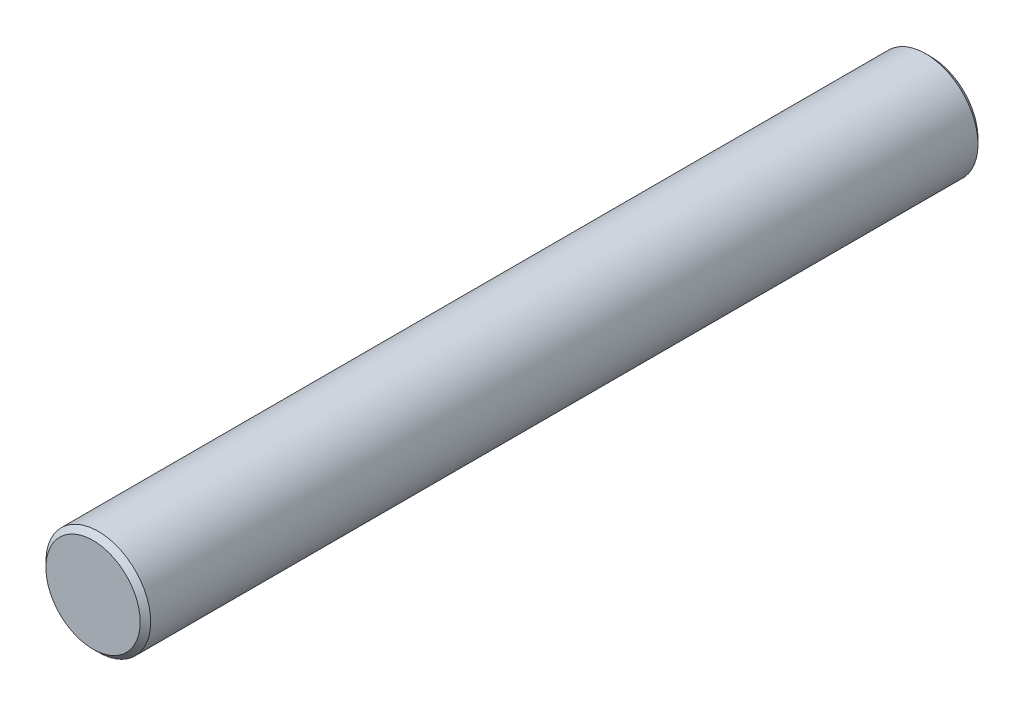
ISO-10303-21;
HEADER;
FILE_DESCRIPTION(('STEP AP214'),'2;1');
FILE_NAME('part.step','',(''),(''),'','','');
FILE_SCHEMA(('AUTOMOTIVE_DESIGN { 1 0 10303 214 1 1 1 1 }'));
ENDSEC;
DATA;
#1=APPLICATION_CONTEXT('core data for automotive mechanical design processes');
#2=APPLICATION_PROTOCOL_DEFINITION('international standard','automotive_design',2000,#1);
#3=PRODUCT_CONTEXT('',#1,'mechanical');
#4=PRODUCT('Part','Part','',(#3));
#5=PRODUCT_RELATED_PRODUCT_CATEGORY('part','',(#4));
#6=PRODUCT_DEFINITION_FORMATION('','',#4);
#7=PRODUCT_DEFINITION_CONTEXT('part definition',#1,'design');
#8=PRODUCT_DEFINITION('design','',#6,#7);
#9=PRODUCT_DEFINITION_SHAPE('','',#8);
#10=(LENGTH_UNIT() NAMED_UNIT(*) SI_UNIT(.MILLI.,.METRE.));
#11=(NAMED_UNIT(*) PLANE_ANGLE_UNIT() SI_UNIT($,.RADIAN.));
#12=(NAMED_UNIT(*) SI_UNIT($,.STERADIAN.) SOLID_ANGLE_UNIT());
#13=UNCERTAINTY_MEASURE_WITH_UNIT(LENGTH_MEASURE(1.E-05),#10,'distance_accuracy_value','');
#14=(GEOMETRIC_REPRESENTATION_CONTEXT(3) GLOBAL_UNCERTAINTY_ASSIGNED_CONTEXT((#13)) GLOBAL_UNIT_ASSIGNED_CONTEXT((#10,
#11,#12)) REPRESENTATION_CONTEXT('',''));
#15=CARTESIAN_POINT('',(0.,0.,0.));
#16=DIRECTION('',(0.,0.,1.));
#17=DIRECTION('',(1.,0.,0.));
#18=AXIS2_PLACEMENT_3D('',#15,#16,#17);
#19=CARTESIAN_POINT('',(0.,0.,80.));
#20=DIRECTION('',(0.,0.,-1.));
#21=DIRECTION('',(-1.,0.,0.));
#22=AXIS2_PLACEMENT_3D('',#19,#20,#21);
#23=CYLINDRICAL_SURFACE('',#22,5.);
#24=CARTESIAN_POINT('',(0.,0.,0.500000000000014));
#25=DIRECTION('',(0.,0.,1.));
#26=DIRECTION('',(1.,0.,0.));
#27=AXIS2_PLACEMENT_3D('',#24,#25,#26);
#28=CIRCLE('',#27,5.);
#29=CARTESIAN_POINT('',(5.,0.,0.500000000000014));
#30=VERTEX_POINT('',#29);
#31=EDGE_CURVE('E58',#30,#30,#28,.T.);
#32=ORIENTED_EDGE('',*,*,#31,.T.);
#33=EDGE_LOOP('',(#32));
#34=FACE_BOUND('',#33,.T.);
#35=CARTESIAN_POINT('',(0.,0.,79.5));
#36=DIRECTION('',(0.,0.,1.));
#37=DIRECTION('',(1.,0.,0.));
#38=AXIS2_PLACEMENT_3D('',#35,#36,#37);
#39=CIRCLE('',#38,5.);
#40=CARTESIAN_POINT('',(5.,0.,79.5));
#41=VERTEX_POINT('',#40);
#42=EDGE_CURVE('E54',#41,#41,#39,.F.);
#43=ORIENTED_EDGE('',*,*,#42,.T.);
#44=EDGE_LOOP('',(#43));
#45=FACE_BOUND('',#44,.T.);
#46=ADVANCED_FACE('F34',(#34,#45),#23,.T.);
#47=CARTESIAN_POINT('',(0.,0.,80.));
#48=DIRECTION('',(0.,0.,1.));
#49=DIRECTION('',(1.,0.,0.));
#50=AXIS2_PLACEMENT_3D('',#47,#48,#49);
#51=PLANE('',#50);
#52=CARTESIAN_POINT('',(0.,0.,80.));
#53=DIRECTION('',(0.,0.,1.));
#54=DIRECTION('',(1.,0.,0.));
#55=AXIS2_PLACEMENT_3D('',#52,#53,#54);
#56=CIRCLE('',#55,4.5);
#57=CARTESIAN_POINT('',(4.5,0.,80.));
#58=VERTEX_POINT('',#57);
#59=EDGE_CURVE('E11',#58,#58,#56,.T.);
#60=ORIENTED_EDGE('',*,*,#59,.T.);
#61=EDGE_LOOP('',(#60));
#62=FACE_BOUND('',#61,.T.);
#63=ADVANCED_FACE('F79',(#62),#51,.T.);
#64=CARTESIAN_POINT('',(0.,0.,0.));
#65=DIRECTION('',(0.,0.,1.));
#66=DIRECTION('',(1.,0.,0.));
#67=AXIS2_PLACEMENT_3D('',#64,#65,#66);
#68=PLANE('',#67);
#69=CARTESIAN_POINT('',(0.,0.,0.));
#70=DIRECTION('',(0.,0.,1.));
#71=DIRECTION('',(1.,0.,0.));
#72=AXIS2_PLACEMENT_3D('',#69,#70,#71);
#73=CIRCLE('',#72,4.49999999999999);
#74=CARTESIAN_POINT('',(4.49999999999999,0.,0.));
#75=VERTEX_POINT('',#74);
#76=EDGE_CURVE('E41',#75,#75,#73,.F.);
#77=ORIENTED_EDGE('',*,*,#76,.T.);
#78=EDGE_LOOP('',(#77));
#79=FACE_BOUND('',#78,.T.);
#80=CARTESIAN_POINT('',(0.,0.,0.));
#81=DIRECTION('',(0.,0.,-1.));
#82=DIRECTION('',(-1.,0.,0.));
#83=AXIS2_PLACEMENT_3D('',#80,#81,#82);
#84=CIRCLE('',#83,2.5);
#85=CARTESIAN_POINT('',(-2.5,0.,0.));
#86=VERTEX_POINT('',#85);
#87=EDGE_CURVE('E109',#86,#86,#84,.T.);
#88=ORIENTED_EDGE('',*,*,#87,.F.);
#89=EDGE_LOOP('',(#88));
#90=FACE_BOUND('',#89,.T.);
#91=ADVANCED_FACE('F48',(#79,#90),#68,.F.);
#92=CARTESIAN_POINT('',(0.,0.,17.4));
#93=DIRECTION('',(0.,0.,-1.));
#94=DIRECTION('',(-1.,0.,0.));
#95=AXIS2_PLACEMENT_3D('',#92,#93,#94);
#96=CONICAL_SURFACE('',#95,2.1,1.02974425867665);
#97=CARTESIAN_POINT('',(0.,0.,18.6618072999579));
#98=VERTEX_POINT('',#97);
#99=VERTEX_LOOP('',#98);
#100=FACE_BOUND('',#99,.T.);
#101=CARTESIAN_POINT('',(0.,0.,17.4));
#102=DIRECTION('',(0.,0.,-1.));
#103=DIRECTION('',(-1.,0.,0.));
#104=AXIS2_PLACEMENT_3D('',#101,#102,#103);
#105=CIRCLE('',#104,2.1);
#106=CARTESIAN_POINT('',(-2.1,0.,17.4));
#107=VERTEX_POINT('',#106);
#108=EDGE_CURVE('E52',#107,#107,#105,.T.);
#109=ORIENTED_EDGE('',*,*,#108,.T.);
#110=EDGE_LOOP('',(#109));
#111=FACE_BOUND('',#110,.T.);
#112=ADVANCED_FACE('F44',(#100,#111),#96,.F.);
#113=CARTESIAN_POINT('',(0.,0.,0.));
#114=DIRECTION('',(0.,0.,-1.));
#115=DIRECTION('',(-1.,0.,0.));
#116=AXIS2_PLACEMENT_3D('',#113,#114,#115);
#117=CYLINDRICAL_SURFACE('',#116,2.1);
#118=ORIENTED_EDGE('',*,*,#108,.F.);
#119=EDGE_LOOP('',(#118));
#120=FACE_BOUND('',#119,.T.);
#121=CARTESIAN_POINT('',(0.,0.,15.));
#122=DIRECTION('',(0.,0.,-1.));
#123=DIRECTION('',(-1.,0.,0.));
#124=AXIS2_PLACEMENT_3D('',#121,#122,#123);
#125=CIRCLE('',#124,2.1);
#126=CARTESIAN_POINT('',(-2.1,0.,15.));
#127=VERTEX_POINT('',#126);
#128=EDGE_CURVE('E55',#127,#127,#125,.T.);
#129=ORIENTED_EDGE('',*,*,#128,.T.);
#130=EDGE_LOOP('',(#129));
#131=FACE_BOUND('',#130,.T.);
#132=ADVANCED_FACE('F47',(#120,#131),#117,.F.);
#133=CARTESIAN_POINT('',(2.1,0.,15.));
#134=DIRECTION('',(0.,0.,1.));
#135=DIRECTION('',(1.,0.,0.));
#136=AXIS2_PLACEMENT_3D('',#133,#134,#135);
#137=PLANE('',#136);
#138=ORIENTED_EDGE('',*,*,#128,.F.);
#139=EDGE_LOOP('',(#138));
#140=FACE_BOUND('',#139,.T.);
#141=CARTESIAN_POINT('',(0.,0.,15.));
#142=DIRECTION('',(0.,0.,-1.));
#143=DIRECTION('',(-1.,0.,0.));
#144=AXIS2_PLACEMENT_3D('',#141,#142,#143);
#145=CIRCLE('',#144,2.5);
#146=CARTESIAN_POINT('',(-2.5,0.,15.));
#147=VERTEX_POINT('',#146);
#148=EDGE_CURVE('E61',#147,#147,#145,.T.);
#149=ORIENTED_EDGE('',*,*,#148,.T.);
#150=EDGE_LOOP('',(#149));
#151=FACE_BOUND('',#150,.T.);
#152=ADVANCED_FACE('F96',(#140,#151),#137,.F.);
#153=CARTESIAN_POINT('',(0.,0.,0.));
#154=DIRECTION('',(0.,0.,-1.));
#155=DIRECTION('',(-1.,0.,0.));
#156=AXIS2_PLACEMENT_3D('',#153,#154,#155);
#157=CYLINDRICAL_SURFACE('',#156,2.5);
#158=ORIENTED_EDGE('',*,*,#148,.F.);
#159=EDGE_LOOP('',(#158));
#160=FACE_BOUND('',#159,.T.);
#161=ORIENTED_EDGE('',*,*,#87,.T.);
#162=EDGE_LOOP('',(#161));
#163=FACE_BOUND('',#162,.T.);
#164=ADVANCED_FACE('F74',(#160,#163),#157,.F.);
#165=CARTESIAN_POINT('',(0.,0.,0.500000000000014));
#166=DIRECTION('',(0.,0.,1.));
#167=DIRECTION('',(1.,0.,0.));
#168=AXIS2_PLACEMENT_3D('',#165,#166,#167);
#169=CONICAL_SURFACE('',#168,5.,0.785398163397445);
#170=ORIENTED_EDGE('',*,*,#76,.F.);
#171=EDGE_LOOP('',(#170));
#172=FACE_BOUND('',#171,.T.);
#173=ORIENTED_EDGE('',*,*,#31,.F.);
#174=EDGE_LOOP('',(#173));
#175=FACE_BOUND('',#174,.T.);
#176=ADVANCED_FACE('F71',(#172,#175),#169,.T.);
#177=CARTESIAN_POINT('',(0.,0.,80.));
#178=DIRECTION('',(0.,0.,-1.));
#179=DIRECTION('',(-1.,0.,0.));
#180=AXIS2_PLACEMENT_3D('',#177,#178,#179);
#181=CONICAL_SURFACE('',#180,4.5,0.785398163397445);
#182=ORIENTED_EDGE('',*,*,#42,.F.);
#183=EDGE_LOOP('',(#182));
#184=FACE_BOUND('',#183,.T.);
#185=ORIENTED_EDGE('',*,*,#59,.F.);
#186=EDGE_LOOP('',(#185));
#187=FACE_BOUND('',#186,.T.);
#188=ADVANCED_FACE('F36',(#184,#187),#181,.T.);
#189=CLOSED_SHELL('',(#46,#63,#91,#112,#132,#152,#164,#176,#188));
#190=MANIFOLD_SOLID_BREP('B2',#189);
#191=ADVANCED_BREP_SHAPE_REPRESENTATION('',(#18,#190),#14);
#192=SHAPE_DEFINITION_REPRESENTATION(#9,#191);
ENDSEC;
END-ISO-10303-21;
